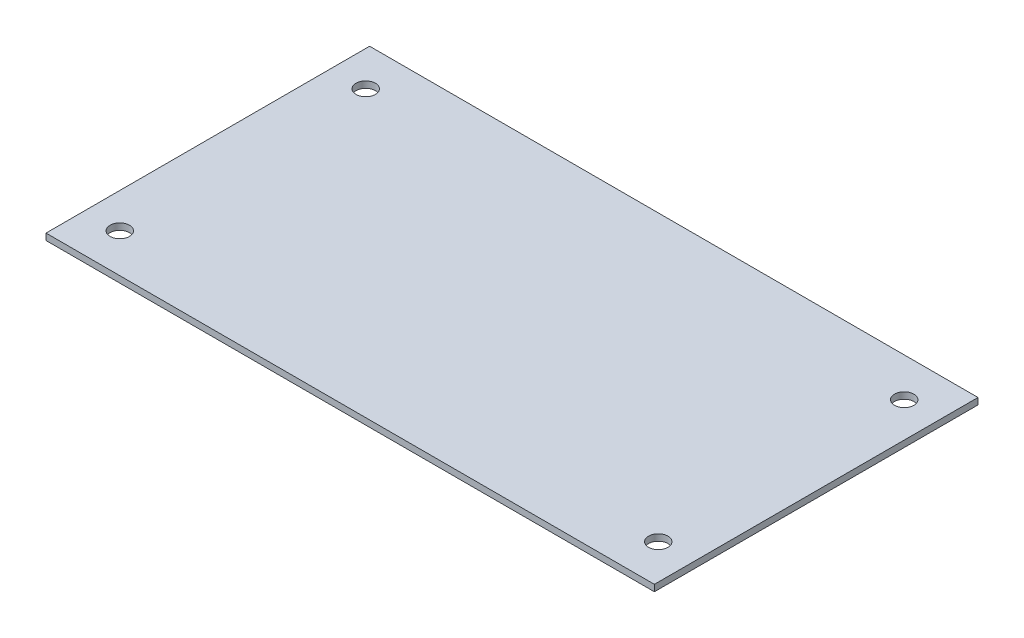
ISO-10303-21;
HEADER;
FILE_DESCRIPTION(('STEP AP214'),'2;1');
FILE_NAME('part.step','',(''),(''),'','','');
FILE_SCHEMA(('AUTOMOTIVE_DESIGN { 1 0 10303 214 1 1 1 1 }'));
ENDSEC;
DATA;
#1=APPLICATION_CONTEXT('core data for automotive mechanical design processes');
#2=APPLICATION_PROTOCOL_DEFINITION('international standard','automotive_design',2000,#1);
#3=PRODUCT_CONTEXT('',#1,'mechanical');
#4=PRODUCT('Part','Part','',(#3));
#5=PRODUCT_RELATED_PRODUCT_CATEGORY('part','',(#4));
#6=PRODUCT_DEFINITION_FORMATION('','',#4);
#7=PRODUCT_DEFINITION_CONTEXT('part definition',#1,'design');
#8=PRODUCT_DEFINITION('design','',#6,#7);
#9=PRODUCT_DEFINITION_SHAPE('','',#8);
#10=(LENGTH_UNIT() NAMED_UNIT(*) SI_UNIT(.MILLI.,.METRE.));
#11=(NAMED_UNIT(*) PLANE_ANGLE_UNIT() SI_UNIT($,.RADIAN.));
#12=(NAMED_UNIT(*) SI_UNIT($,.STERADIAN.) SOLID_ANGLE_UNIT());
#13=UNCERTAINTY_MEASURE_WITH_UNIT(LENGTH_MEASURE(1.E-05),#10,'distance_accuracy_value','');
#14=(GEOMETRIC_REPRESENTATION_CONTEXT(3) GLOBAL_UNCERTAINTY_ASSIGNED_CONTEXT((#13)) GLOBAL_UNIT_ASSIGNED_CONTEXT((#10,
#11,#12)) REPRESENTATION_CONTEXT('',''));
#15=CARTESIAN_POINT('',(0.,0.,0.));
#16=DIRECTION('',(0.,0.,1.));
#17=DIRECTION('',(1.,0.,0.));
#18=AXIS2_PLACEMENT_3D('',#15,#16,#17);
#19=CARTESIAN_POINT('',(0.,1.,0.));
#20=DIRECTION('',(0.,-1.,0.));
#21=DIRECTION('',(0.,0.,-1.));
#22=AXIS2_PLACEMENT_3D('',#19,#20,#21);
#23=PLANE('',#22);
#24=CARTESIAN_POINT('',(41.6,1.,19.));
#25=DIRECTION('',(0.,1.,0.));
#26=DIRECTION('',(0.,0.,1.));
#27=AXIS2_PLACEMENT_3D('',#24,#25,#26);
#28=CIRCLE('',#27,1.5);
#29=CARTESIAN_POINT('',(41.6,1.,20.5));
#30=VERTEX_POINT('',#29);
#31=EDGE_CURVE('E121',#30,#30,#28,.T.);
#32=ORIENTED_EDGE('',*,*,#31,.F.);
#33=EDGE_LOOP('',(#32));
#34=FACE_BOUND('',#33,.T.);
#35=CARTESIAN_POINT('',(-41.6,1.,-19.));
#36=DIRECTION('',(0.,1.,0.));
#37=DIRECTION('',(0.,0.,1.));
#38=AXIS2_PLACEMENT_3D('',#35,#36,#37);
#39=CIRCLE('',#38,1.5);
#40=CARTESIAN_POINT('',(-41.6,1.,-17.5));
#41=VERTEX_POINT('',#40);
#42=EDGE_CURVE('E100',#41,#41,#39,.T.);
#43=ORIENTED_EDGE('',*,*,#42,.F.);
#44=EDGE_LOOP('',(#43));
#45=FACE_BOUND('',#44,.T.);
#46=DIRECTION('',(0.,0.,-1.));
#47=VECTOR('',#46,1.);
#48=CARTESIAN_POINT('',(46.9999999999998,1.,25.));
#49=LINE('',#48,#47);
#50=CARTESIAN_POINT('',(46.9999999999998,1.,25.));
#51=VERTEX_POINT('',#50);
#52=CARTESIAN_POINT('',(46.9999999999998,1.,-25.));
#53=VERTEX_POINT('',#52);
#54=EDGE_CURVE('E85',#51,#53,#49,.T.);
#55=ORIENTED_EDGE('',*,*,#54,.T.);
#56=DIRECTION('',(-1.,0.,0.));
#57=VECTOR('',#56,1.);
#58=CARTESIAN_POINT('',(-47.0000000000002,1.,-25.));
#59=LINE('',#58,#57);
#60=CARTESIAN_POINT('',(-47.0000000000002,1.,-25.));
#61=VERTEX_POINT('',#60);
#62=EDGE_CURVE('E80',#53,#61,#59,.T.);
#63=ORIENTED_EDGE('',*,*,#62,.T.);
#64=DIRECTION('',(0.,0.,1.));
#65=VECTOR('',#64,1.);
#66=CARTESIAN_POINT('',(-47.0000000000002,1.,25.));
#67=LINE('',#66,#65);
#68=CARTESIAN_POINT('',(-47.0000000000002,1.,25.));
#69=VERTEX_POINT('',#68);
#70=EDGE_CURVE('E83',#61,#69,#67,.T.);
#71=ORIENTED_EDGE('',*,*,#70,.T.);
#72=DIRECTION('',(1.,0.,0.));
#73=VECTOR('',#72,1.);
#74=CARTESIAN_POINT('',(-47.0000000000002,1.,25.));
#75=LINE('',#74,#73);
#76=EDGE_CURVE('E50',#69,#51,#75,.T.);
#77=ORIENTED_EDGE('',*,*,#76,.T.);
#78=EDGE_LOOP('',(#55,#63,#71,#77));
#79=FACE_BOUND('',#78,.T.);
#80=CARTESIAN_POINT('',(41.6,1.,-19.));
#81=DIRECTION('',(0.,1.,0.));
#82=DIRECTION('',(0.,0.,-1.));
#83=AXIS2_PLACEMENT_3D('',#80,#81,#82);
#84=CIRCLE('',#83,1.5);
#85=CARTESIAN_POINT('',(41.6,1.,-20.5));
#86=VERTEX_POINT('',#85);
#87=EDGE_CURVE('E115',#86,#86,#84,.T.);
#88=ORIENTED_EDGE('',*,*,#87,.F.);
#89=EDGE_LOOP('',(#88));
#90=FACE_BOUND('',#89,.T.);
#91=CARTESIAN_POINT('',(-41.6,1.,19.));
#92=DIRECTION('',(0.,1.,0.));
#93=DIRECTION('',(0.,0.,-1.));
#94=AXIS2_PLACEMENT_3D('',#91,#92,#93);
#95=CIRCLE('',#94,1.5);
#96=CARTESIAN_POINT('',(-41.6,1.,17.5));
#97=VERTEX_POINT('',#96);
#98=EDGE_CURVE('E127',#97,#97,#95,.T.);
#99=ORIENTED_EDGE('',*,*,#98,.F.);
#100=EDGE_LOOP('',(#99));
#101=FACE_BOUND('',#100,.T.);
#102=ADVANCED_FACE('F33',(#34,#45,#79,#90,#101),#23,.F.);
#103=CARTESIAN_POINT('',(0.,0.,0.));
#104=DIRECTION('',(0.,-1.,0.));
#105=DIRECTION('',(0.,0.,-1.));
#106=AXIS2_PLACEMENT_3D('',#103,#104,#105);
#107=PLANE('',#106);
#108=CARTESIAN_POINT('',(41.6,0.,19.));
#109=DIRECTION('',(0.,1.,0.));
#110=DIRECTION('',(0.,0.,1.));
#111=AXIS2_PLACEMENT_3D('',#108,#109,#110);
#112=CIRCLE('',#111,1.5);
#113=CARTESIAN_POINT('',(41.6,0.,20.5));
#114=VERTEX_POINT('',#113);
#115=EDGE_CURVE('E124',#114,#114,#112,.T.);
#116=ORIENTED_EDGE('',*,*,#115,.T.);
#117=EDGE_LOOP('',(#116));
#118=FACE_BOUND('',#117,.T.);
#119=CARTESIAN_POINT('',(-41.6,0.,-19.));
#120=DIRECTION('',(0.,1.,0.));
#121=DIRECTION('',(0.,0.,1.));
#122=AXIS2_PLACEMENT_3D('',#119,#120,#121);
#123=CIRCLE('',#122,1.5);
#124=CARTESIAN_POINT('',(-41.6,0.,-17.5));
#125=VERTEX_POINT('',#124);
#126=EDGE_CURVE('E112',#125,#125,#123,.T.);
#127=ORIENTED_EDGE('',*,*,#126,.T.);
#128=EDGE_LOOP('',(#127));
#129=FACE_BOUND('',#128,.T.);
#130=DIRECTION('',(0.,0.,-1.));
#131=VECTOR('',#130,1.);
#132=CARTESIAN_POINT('',(46.9999999999998,0.,25.));
#133=LINE('',#132,#131);
#134=CARTESIAN_POINT('',(46.9999999999998,0.,25.));
#135=VERTEX_POINT('',#134);
#136=CARTESIAN_POINT('',(46.9999999999998,0.,-25.));
#137=VERTEX_POINT('',#136);
#138=EDGE_CURVE('E97',#135,#137,#133,.T.);
#139=ORIENTED_EDGE('',*,*,#138,.F.);
#140=DIRECTION('',(1.,0.,0.));
#141=VECTOR('',#140,1.);
#142=CARTESIAN_POINT('',(-47.0000000000002,0.,25.));
#143=LINE('',#142,#141);
#144=CARTESIAN_POINT('',(-47.0000000000002,0.,25.));
#145=VERTEX_POINT('',#144);
#146=EDGE_CURVE('E73',#145,#135,#143,.T.);
#147=ORIENTED_EDGE('',*,*,#146,.F.);
#148=DIRECTION('',(0.,0.,1.));
#149=VECTOR('',#148,1.);
#150=CARTESIAN_POINT('',(-47.0000000000002,0.,25.));
#151=LINE('',#150,#149);
#152=CARTESIAN_POINT('',(-47.0000000000002,0.,-25.));
#153=VERTEX_POINT('',#152);
#154=EDGE_CURVE('E67',#153,#145,#151,.T.);
#155=ORIENTED_EDGE('',*,*,#154,.F.);
#156=DIRECTION('',(-1.,0.,0.));
#157=VECTOR('',#156,1.);
#158=CARTESIAN_POINT('',(-47.0000000000002,0.,-25.));
#159=LINE('',#158,#157);
#160=EDGE_CURVE('E89',#137,#153,#159,.T.);
#161=ORIENTED_EDGE('',*,*,#160,.F.);
#162=EDGE_LOOP('',(#139,#147,#155,#161));
#163=FACE_BOUND('',#162,.T.);
#164=CARTESIAN_POINT('',(41.6,0.,-19.));
#165=DIRECTION('',(0.,1.,0.));
#166=DIRECTION('',(0.,0.,-1.));
#167=AXIS2_PLACEMENT_3D('',#164,#165,#166);
#168=CIRCLE('',#167,1.5);
#169=CARTESIAN_POINT('',(41.6,0.,-20.5));
#170=VERTEX_POINT('',#169);
#171=EDGE_CURVE('E118',#170,#170,#168,.T.);
#172=ORIENTED_EDGE('',*,*,#171,.T.);
#173=EDGE_LOOP('',(#172));
#174=FACE_BOUND('',#173,.T.);
#175=CARTESIAN_POINT('',(-41.6,0.,19.));
#176=DIRECTION('',(0.,1.,0.));
#177=DIRECTION('',(0.,0.,-1.));
#178=AXIS2_PLACEMENT_3D('',#175,#176,#177);
#179=CIRCLE('',#178,1.5);
#180=CARTESIAN_POINT('',(-41.6,0.,17.5));
#181=VERTEX_POINT('',#180);
#182=EDGE_CURVE('E130',#181,#181,#179,.T.);
#183=ORIENTED_EDGE('',*,*,#182,.T.);
#184=EDGE_LOOP('',(#183));
#185=FACE_BOUND('',#184,.T.);
#186=ADVANCED_FACE('F108',(#118,#129,#163,#174,#185),#107,.T.);
#187=CARTESIAN_POINT('',(46.9999999999998,1.,25.));
#188=DIRECTION('',(-1.,0.,0.));
#189=DIRECTION('',(0.,0.,1.));
#190=AXIS2_PLACEMENT_3D('',#187,#188,#189);
#191=PLANE('',#190);
#192=ORIENTED_EDGE('',*,*,#138,.T.);
#193=DIRECTION('',(0.,-1.,0.));
#194=VECTOR('',#193,1.);
#195=CARTESIAN_POINT('',(46.9999999999998,1.,-25.));
#196=LINE('',#195,#194);
#197=EDGE_CURVE('E11',#53,#137,#196,.T.);
#198=ORIENTED_EDGE('',*,*,#197,.F.);
#199=ORIENTED_EDGE('',*,*,#54,.F.);
#200=DIRECTION('',(0.,-1.,0.));
#201=VECTOR('',#200,1.);
#202=CARTESIAN_POINT('',(46.9999999999998,1.,25.));
#203=LINE('',#202,#201);
#204=EDGE_CURVE('E93',#51,#135,#203,.T.);
#205=ORIENTED_EDGE('',*,*,#204,.T.);
#206=EDGE_LOOP('',(#192,#198,#199,#205));
#207=FACE_BOUND('',#206,.T.);
#208=ADVANCED_FACE('F35',(#207),#191,.F.);
#209=CARTESIAN_POINT('',(-47.0000000000002,1.,-25.));
#210=DIRECTION('',(0.,0.,1.));
#211=DIRECTION('',(1.,0.,0.));
#212=AXIS2_PLACEMENT_3D('',#209,#210,#211);
#213=PLANE('',#212);
#214=ORIENTED_EDGE('',*,*,#160,.T.);
#215=DIRECTION('',(0.,-1.,0.));
#216=VECTOR('',#215,1.);
#217=CARTESIAN_POINT('',(-47.0000000000002,1.,-25.));
#218=LINE('',#217,#216);
#219=EDGE_CURVE('E42',#61,#153,#218,.T.);
#220=ORIENTED_EDGE('',*,*,#219,.F.);
#221=ORIENTED_EDGE('',*,*,#62,.F.);
#222=ORIENTED_EDGE('',*,*,#197,.T.);
#223=EDGE_LOOP('',(#214,#220,#221,#222));
#224=FACE_BOUND('',#223,.T.);
#225=ADVANCED_FACE('F88',(#224),#213,.F.);
#226=CARTESIAN_POINT('',(-47.0000000000002,1.,25.));
#227=DIRECTION('',(1.,0.,0.));
#228=DIRECTION('',(0.,0.,-1.));
#229=AXIS2_PLACEMENT_3D('',#226,#227,#228);
#230=PLANE('',#229);
#231=ORIENTED_EDGE('',*,*,#154,.T.);
#232=DIRECTION('',(0.,-1.,0.));
#233=VECTOR('',#232,1.);
#234=CARTESIAN_POINT('',(-47.0000000000002,1.,25.));
#235=LINE('',#234,#233);
#236=EDGE_CURVE('E90',#69,#145,#235,.T.);
#237=ORIENTED_EDGE('',*,*,#236,.F.);
#238=ORIENTED_EDGE('',*,*,#70,.F.);
#239=ORIENTED_EDGE('',*,*,#219,.T.);
#240=EDGE_LOOP('',(#231,#237,#238,#239));
#241=FACE_BOUND('',#240,.T.);
#242=ADVANCED_FACE('F91',(#241),#230,.F.);
#243=CARTESIAN_POINT('',(-47.0000000000002,1.,25.));
#244=DIRECTION('',(0.,0.,-1.));
#245=DIRECTION('',(-1.,0.,0.));
#246=AXIS2_PLACEMENT_3D('',#243,#244,#245);
#247=PLANE('',#246);
#248=ORIENTED_EDGE('',*,*,#146,.T.);
#249=ORIENTED_EDGE('',*,*,#204,.F.);
#250=ORIENTED_EDGE('',*,*,#76,.F.);
#251=ORIENTED_EDGE('',*,*,#236,.T.);
#252=EDGE_LOOP('',(#248,#249,#250,#251));
#253=FACE_BOUND('',#252,.T.);
#254=ADVANCED_FACE('F105',(#253),#247,.F.);
#255=CARTESIAN_POINT('',(-41.6,1.,-19.));
#256=DIRECTION('',(0.,-1.,0.));
#257=DIRECTION('',(0.,0.,-1.));
#258=AXIS2_PLACEMENT_3D('',#255,#256,#257);
#259=CYLINDRICAL_SURFACE('',#258,1.5);
#260=ORIENTED_EDGE('',*,*,#42,.T.);
#261=EDGE_LOOP('',(#260));
#262=FACE_BOUND('',#261,.T.);
#263=ORIENTED_EDGE('',*,*,#126,.F.);
#264=EDGE_LOOP('',(#263));
#265=FACE_BOUND('',#264,.T.);
#266=ADVANCED_FACE('F150',(#262,#265),#259,.F.);
#267=CARTESIAN_POINT('',(41.6,1.,-19.));
#268=DIRECTION('',(0.,-1.,0.));
#269=DIRECTION('',(0.,0.,-1.));
#270=AXIS2_PLACEMENT_3D('',#267,#268,#269);
#271=CYLINDRICAL_SURFACE('',#270,1.5);
#272=ORIENTED_EDGE('',*,*,#87,.T.);
#273=EDGE_LOOP('',(#272));
#274=FACE_BOUND('',#273,.T.);
#275=ORIENTED_EDGE('',*,*,#171,.F.);
#276=EDGE_LOOP('',(#275));
#277=FACE_BOUND('',#276,.T.);
#278=ADVANCED_FACE('F196',(#274,#277),#271,.F.);
#279=CARTESIAN_POINT('',(41.6,1.,19.));
#280=DIRECTION('',(0.,-1.,0.));
#281=DIRECTION('',(0.,0.,-1.));
#282=AXIS2_PLACEMENT_3D('',#279,#280,#281);
#283=CYLINDRICAL_SURFACE('',#282,1.5);
#284=ORIENTED_EDGE('',*,*,#31,.T.);
#285=EDGE_LOOP('',(#284));
#286=FACE_BOUND('',#285,.T.);
#287=ORIENTED_EDGE('',*,*,#115,.F.);
#288=EDGE_LOOP('',(#287));
#289=FACE_BOUND('',#288,.T.);
#290=ADVANCED_FACE('F204',(#286,#289),#283,.F.);
#291=CARTESIAN_POINT('',(-41.6,1.,19.));
#292=DIRECTION('',(0.,-1.,0.));
#293=DIRECTION('',(0.,0.,-1.));
#294=AXIS2_PLACEMENT_3D('',#291,#292,#293);
#295=CYLINDRICAL_SURFACE('',#294,1.5);
#296=ORIENTED_EDGE('',*,*,#98,.T.);
#297=EDGE_LOOP('',(#296));
#298=FACE_BOUND('',#297,.T.);
#299=ORIENTED_EDGE('',*,*,#182,.F.);
#300=EDGE_LOOP('',(#299));
#301=FACE_BOUND('',#300,.T.);
#302=ADVANCED_FACE('F136',(#298,#301),#295,.F.);
#303=CLOSED_SHELL('',(#102,#186,#208,#225,#242,#254,#266,#278,#290,#302));
#304=MANIFOLD_SOLID_BREP('B2',#303);
#305=ADVANCED_BREP_SHAPE_REPRESENTATION('',(#18,#304),#14);
#306=SHAPE_DEFINITION_REPRESENTATION(#9,#305);
ENDSEC;
END-ISO-10303-21;
